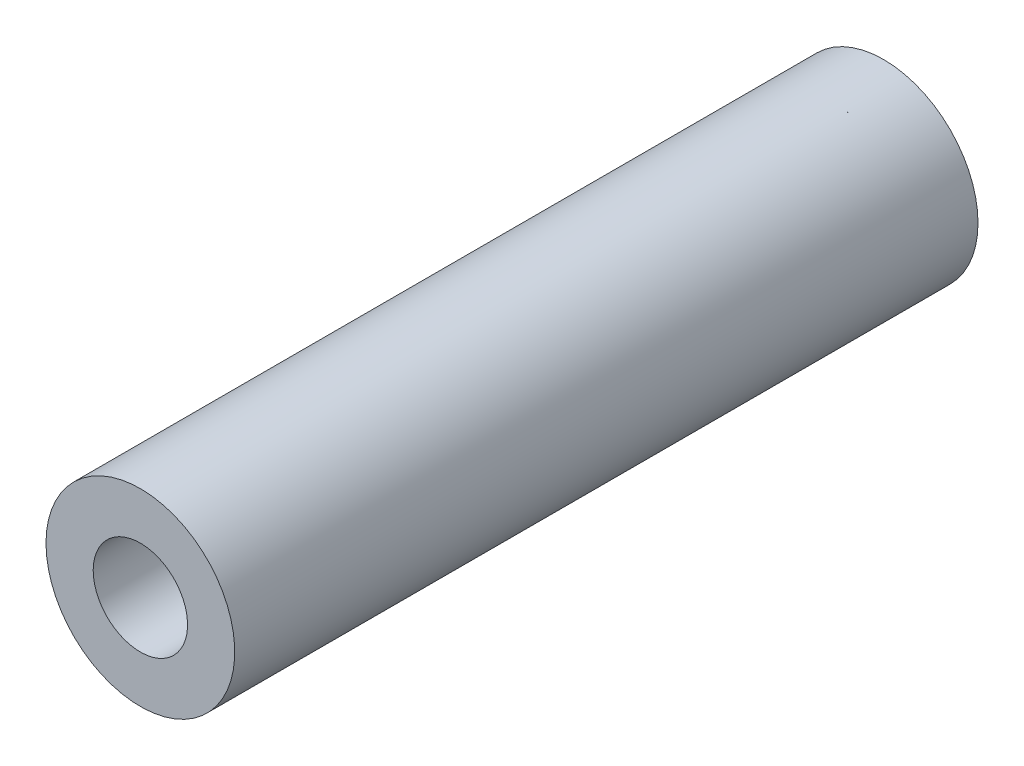
ISO-10303-21;
HEADER;
FILE_DESCRIPTION(('STEP AP214'),'2;1');
FILE_NAME('part.step','',(''),(''),'','','');
FILE_SCHEMA(('AUTOMOTIVE_DESIGN { 1 0 10303 214 1 1 1 1 }'));
ENDSEC;
DATA;
#1=APPLICATION_CONTEXT('core data for automotive mechanical design processes');
#2=APPLICATION_PROTOCOL_DEFINITION('international standard','automotive_design',2000,#1);
#3=PRODUCT_CONTEXT('',#1,'mechanical');
#4=PRODUCT('Part','Part','',(#3));
#5=PRODUCT_RELATED_PRODUCT_CATEGORY('part','',(#4));
#6=PRODUCT_DEFINITION_FORMATION('','',#4);
#7=PRODUCT_DEFINITION_CONTEXT('part definition',#1,'design');
#8=PRODUCT_DEFINITION('design','',#6,#7);
#9=PRODUCT_DEFINITION_SHAPE('','',#8);
#10=(LENGTH_UNIT() NAMED_UNIT(*) SI_UNIT(.MILLI.,.METRE.));
#11=(NAMED_UNIT(*) PLANE_ANGLE_UNIT() SI_UNIT($,.RADIAN.));
#12=(NAMED_UNIT(*) SI_UNIT($,.STERADIAN.) SOLID_ANGLE_UNIT());
#13=UNCERTAINTY_MEASURE_WITH_UNIT(LENGTH_MEASURE(1.E-05),#10,'distance_accuracy_value','');
#14=(GEOMETRIC_REPRESENTATION_CONTEXT(3) GLOBAL_UNCERTAINTY_ASSIGNED_CONTEXT((#13)) GLOBAL_UNIT_ASSIGNED_CONTEXT((#10,
#11,#12)) REPRESENTATION_CONTEXT('',''));
#15=CARTESIAN_POINT('',(0.,0.,0.));
#16=DIRECTION('',(0.,0.,1.));
#17=DIRECTION('',(1.,0.,0.));
#18=AXIS2_PLACEMENT_3D('',#15,#16,#17);
#19=CARTESIAN_POINT('',(55.5752,-55.5752,0.));
#20=DIRECTION('',(0.,0.,1.));
#21=DIRECTION('',(1.,0.,0.));
#22=AXIS2_PLACEMENT_3D('',#19,#20,#21);
#23=PLANE('',#22);
#24=CARTESIAN_POINT('',(55.5752,-55.5752,0.));
#25=DIRECTION('',(0.,0.,1.));
#26=DIRECTION('',(1.,0.,0.));
#27=AXIS2_PLACEMENT_3D('',#24,#25,#26);
#28=CIRCLE('',#27,6.35);
#29=CARTESIAN_POINT('',(61.9252,-55.5752,0.));
#30=VERTEX_POINT('',#29);
#31=EDGE_CURVE('E38',#30,#30,#28,.T.);
#32=ORIENTED_EDGE('',*,*,#31,.F.);
#33=EDGE_LOOP('',(#32));
#34=FACE_BOUND('',#33,.T.);
#35=CARTESIAN_POINT('',(55.5752,-55.5752,0.));
#36=DIRECTION('',(0.,0.,1.));
#37=DIRECTION('',(1.,0.,0.));
#38=AXIS2_PLACEMENT_3D('',#35,#36,#37);
#39=CIRCLE('',#38,3.175);
#40=CARTESIAN_POINT('',(58.7502,-55.5752,0.));
#41=VERTEX_POINT('',#40);
#42=EDGE_CURVE('E47',#41,#41,#39,.T.);
#43=ORIENTED_EDGE('',*,*,#42,.T.);
#44=EDGE_LOOP('',(#43));
#45=FACE_BOUND('',#44,.T.);
#46=ADVANCED_FACE('F31',(#34,#45),#23,.F.);
#47=CARTESIAN_POINT('',(55.5752,-55.5752,67.9731122421383));
#48=DIRECTION('',(0.,0.,-1.));
#49=DIRECTION('',(-1.,0.,0.));
#50=AXIS2_PLACEMENT_3D('',#47,#48,#49);
#51=CYLINDRICAL_SURFACE('',#50,6.35);
#52=CARTESIAN_POINT('',(55.5752,-55.5752,50.0126));
#53=DIRECTION('',(0.,0.,-1.));
#54=DIRECTION('',(-1.,0.,0.));
#55=AXIS2_PLACEMENT_3D('',#52,#53,#54);
#56=CIRCLE('',#55,6.35);
#57=CARTESIAN_POINT('',(49.2252,-55.5752,50.0126));
#58=VERTEX_POINT('',#57);
#59=EDGE_CURVE('E42',#58,#58,#56,.T.);
#60=ORIENTED_EDGE('',*,*,#59,.T.);
#61=EDGE_LOOP('',(#60));
#62=FACE_BOUND('',#61,.T.);
#63=ORIENTED_EDGE('',*,*,#31,.T.);
#64=EDGE_LOOP('',(#63));
#65=FACE_BOUND('',#64,.T.);
#66=ADVANCED_FACE('F55',(#62,#65),#51,.T.);
#67=CARTESIAN_POINT('',(55.5752,-55.5752,67.9731122421383));
#68=DIRECTION('',(0.,0.,-1.));
#69=DIRECTION('',(-1.,0.,0.));
#70=AXIS2_PLACEMENT_3D('',#67,#68,#69);
#71=CYLINDRICAL_SURFACE('',#70,3.175);
#72=CARTESIAN_POINT('',(55.5752,-55.5752,50.0126));
#73=DIRECTION('',(0.,0.,-1.));
#74=DIRECTION('',(-1.,0.,0.));
#75=AXIS2_PLACEMENT_3D('',#72,#73,#74);
#76=CIRCLE('',#75,3.175);
#77=CARTESIAN_POINT('',(52.4002,-55.5752,50.0126));
#78=VERTEX_POINT('',#77);
#79=EDGE_CURVE('E10',#78,#78,#76,.T.);
#80=ORIENTED_EDGE('',*,*,#79,.F.);
#81=EDGE_LOOP('',(#80));
#82=FACE_BOUND('',#81,.T.);
#83=ORIENTED_EDGE('',*,*,#42,.F.);
#84=EDGE_LOOP('',(#83));
#85=FACE_BOUND('',#84,.T.);
#86=ADVANCED_FACE('F53',(#82,#85),#71,.F.);
#87=CARTESIAN_POINT('',(47.6250000000001,-63.5,50.0126));
#88=DIRECTION('',(0.,0.,-1.));
#89=DIRECTION('',(1.,0.,0.));
#90=AXIS2_PLACEMENT_3D('',#87,#88,#89);
#91=PLANE('',#90);
#92=ORIENTED_EDGE('',*,*,#79,.T.);
#93=EDGE_LOOP('',(#92));
#94=FACE_BOUND('',#93,.T.);
#95=ORIENTED_EDGE('',*,*,#59,.F.);
#96=EDGE_LOOP('',(#95));
#97=FACE_BOUND('',#96,.T.);
#98=ADVANCED_FACE('F33',(#94,#97),#91,.F.);
#99=CLOSED_SHELL('',(#46,#66,#86,#98));
#100=MANIFOLD_SOLID_BREP('B2',#99);
#101=ADVANCED_BREP_SHAPE_REPRESENTATION('',(#18,#100),#14);
#102=SHAPE_DEFINITION_REPRESENTATION(#9,#101);
ENDSEC;
END-ISO-10303-21;
